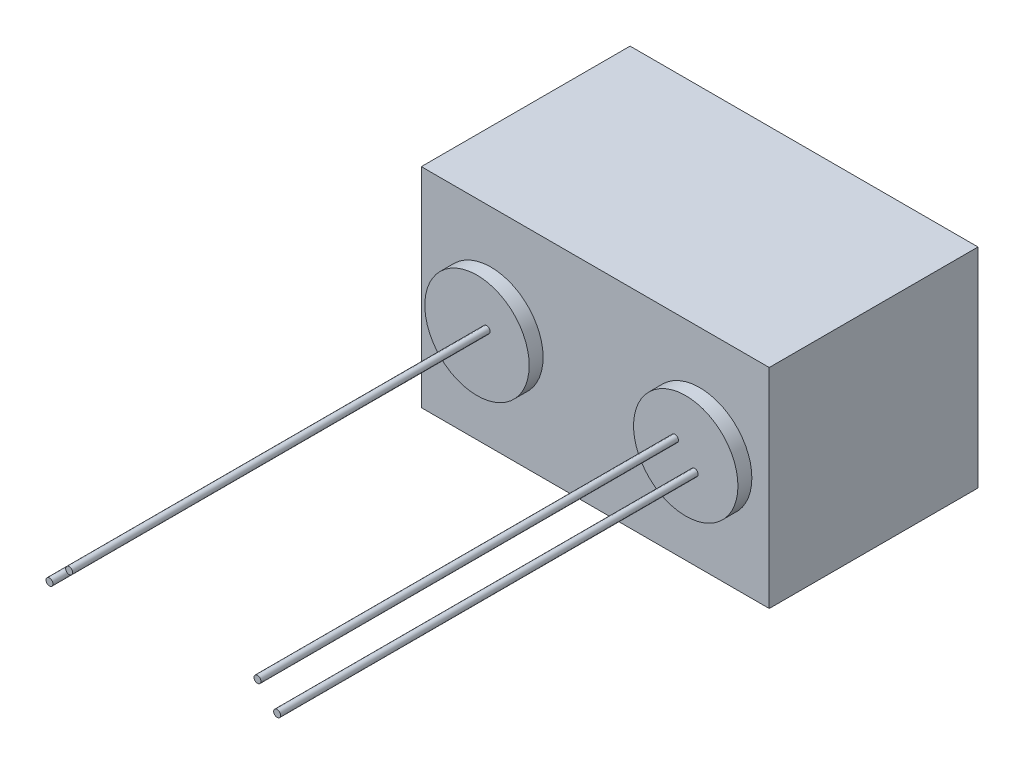
ISO-10303-21;
HEADER;
FILE_DESCRIPTION(('STEP AP214'),'2;1');
FILE_NAME('part.step','',(''),(''),'','','');
FILE_SCHEMA(('AUTOMOTIVE_DESIGN { 1 0 10303 214 1 1 1 1 }'));
ENDSEC;
DATA;
#1=APPLICATION_CONTEXT('core data for automotive mechanical design processes');
#2=APPLICATION_PROTOCOL_DEFINITION('international standard','automotive_design',2000,#1);
#3=PRODUCT_CONTEXT('',#1,'mechanical');
#4=PRODUCT('Part','Part','',(#3));
#5=PRODUCT_RELATED_PRODUCT_CATEGORY('part','',(#4));
#6=PRODUCT_DEFINITION_FORMATION('','',#4);
#7=PRODUCT_DEFINITION_CONTEXT('part definition',#1,'design');
#8=PRODUCT_DEFINITION('design','',#6,#7);
#9=PRODUCT_DEFINITION_SHAPE('','',#8);
#10=(LENGTH_UNIT() NAMED_UNIT(*) SI_UNIT(.MILLI.,.METRE.));
#11=(NAMED_UNIT(*) PLANE_ANGLE_UNIT() SI_UNIT($,.RADIAN.));
#12=(NAMED_UNIT(*) SI_UNIT($,.STERADIAN.) SOLID_ANGLE_UNIT());
#13=UNCERTAINTY_MEASURE_WITH_UNIT(LENGTH_MEASURE(1.E-05),#10,'distance_accuracy_value','');
#14=(GEOMETRIC_REPRESENTATION_CONTEXT(3) GLOBAL_UNCERTAINTY_ASSIGNED_CONTEXT((#13)) GLOBAL_UNIT_ASSIGNED_CONTEXT((#10,
#11,#12)) REPRESENTATION_CONTEXT('',''));
#15=CARTESIAN_POINT('',(0.,0.,0.));
#16=DIRECTION('',(0.,0.,1.));
#17=DIRECTION('',(1.,0.,0.));
#18=AXIS2_PLACEMENT_3D('',#15,#16,#17);
#19=CARTESIAN_POINT('',(-63.5,38.1,76.2));
#20=DIRECTION('',(1.,0.,0.));
#21=DIRECTION('',(0.,0.,-1.));
#22=AXIS2_PLACEMENT_3D('',#19,#20,#21);
#23=PLANE('',#22);
#24=DIRECTION('',(0.,-1.,0.));
#25=VECTOR('',#24,1.);
#26=CARTESIAN_POINT('',(-63.5,38.1,0.));
#27=LINE('',#26,#25);
#28=CARTESIAN_POINT('',(-63.5,38.1,0.));
#29=VERTEX_POINT('',#28);
#30=CARTESIAN_POINT('',(-63.5,-38.1,0.));
#31=VERTEX_POINT('',#30);
#32=EDGE_CURVE('E100',#29,#31,#27,.T.);
#33=ORIENTED_EDGE('',*,*,#32,.T.);
#34=DIRECTION('',(0.,0.,-1.));
#35=VECTOR('',#34,1.);
#36=CARTESIAN_POINT('',(-63.5,-38.1,76.2));
#37=LINE('',#36,#35);
#38=CARTESIAN_POINT('',(-63.5,-38.1,76.2));
#39=VERTEX_POINT('',#38);
#40=EDGE_CURVE('E11',#39,#31,#37,.T.);
#41=ORIENTED_EDGE('',*,*,#40,.F.);
#42=DIRECTION('',(0.,-1.,0.));
#43=VECTOR('',#42,1.);
#44=CARTESIAN_POINT('',(-63.5,38.1,76.2));
#45=LINE('',#44,#43);
#46=CARTESIAN_POINT('',(-63.5,38.1,76.2));
#47=VERTEX_POINT('',#46);
#48=EDGE_CURVE('E88',#47,#39,#45,.T.);
#49=ORIENTED_EDGE('',*,*,#48,.F.);
#50=DIRECTION('',(0.,0.,-1.));
#51=VECTOR('',#50,1.);
#52=CARTESIAN_POINT('',(-63.5,38.1,76.2));
#53=LINE('',#52,#51);
#54=EDGE_CURVE('E96',#47,#29,#53,.T.);
#55=ORIENTED_EDGE('',*,*,#54,.T.);
#56=EDGE_LOOP('',(#33,#41,#49,#55));
#57=FACE_BOUND('',#56,.T.);
#58=ADVANCED_FACE('F37',(#57),#23,.F.);
#59=CARTESIAN_POINT('',(-63.5,-38.1,76.2));
#60=DIRECTION('',(0.,1.,0.));
#61=DIRECTION('',(0.,0.,1.));
#62=AXIS2_PLACEMENT_3D('',#59,#60,#61);
#63=PLANE('',#62);
#64=DIRECTION('',(1.,0.,0.));
#65=VECTOR('',#64,1.);
#66=CARTESIAN_POINT('',(-63.5,-38.1,0.));
#67=LINE('',#66,#65);
#68=CARTESIAN_POINT('',(63.5,-38.1,0.));
#69=VERTEX_POINT('',#68);
#70=EDGE_CURVE('E92',#31,#69,#67,.T.);
#71=ORIENTED_EDGE('',*,*,#70,.T.);
#72=DIRECTION('',(0.,0.,-1.));
#73=VECTOR('',#72,1.);
#74=CARTESIAN_POINT('',(63.5,-38.1,76.2));
#75=LINE('',#74,#73);
#76=CARTESIAN_POINT('',(63.5,-38.1,76.2));
#77=VERTEX_POINT('',#76);
#78=EDGE_CURVE('E45',#77,#69,#75,.T.);
#79=ORIENTED_EDGE('',*,*,#78,.F.);
#80=DIRECTION('',(1.,0.,0.));
#81=VECTOR('',#80,1.);
#82=CARTESIAN_POINT('',(-63.5,-38.1,76.2));
#83=LINE('',#82,#81);
#84=EDGE_CURVE('E83',#39,#77,#83,.T.);
#85=ORIENTED_EDGE('',*,*,#84,.F.);
#86=ORIENTED_EDGE('',*,*,#40,.T.);
#87=EDGE_LOOP('',(#71,#79,#85,#86));
#88=FACE_BOUND('',#87,.T.);
#89=ADVANCED_FACE('F91',(#88),#63,.F.);
#90=CARTESIAN_POINT('',(63.5,38.1,76.2));
#91=DIRECTION('',(-1.,0.,0.));
#92=DIRECTION('',(0.,-1.,0.));
#93=AXIS2_PLACEMENT_3D('',#90,#91,#92);
#94=PLANE('',#93);
#95=DIRECTION('',(0.,1.,0.));
#96=VECTOR('',#95,1.);
#97=CARTESIAN_POINT('',(63.5,38.1,0.));
#98=LINE('',#97,#96);
#99=CARTESIAN_POINT('',(63.5,38.1,0.));
#100=VERTEX_POINT('',#99);
#101=EDGE_CURVE('E70',#69,#100,#98,.T.);
#102=ORIENTED_EDGE('',*,*,#101,.T.);
#103=DIRECTION('',(0.,0.,-1.));
#104=VECTOR('',#103,1.);
#105=CARTESIAN_POINT('',(63.5,38.1,76.2));
#106=LINE('',#105,#104);
#107=CARTESIAN_POINT('',(63.5,38.1,76.2));
#108=VERTEX_POINT('',#107);
#109=EDGE_CURVE('E93',#108,#100,#106,.T.);
#110=ORIENTED_EDGE('',*,*,#109,.F.);
#111=DIRECTION('',(0.,1.,0.));
#112=VECTOR('',#111,1.);
#113=CARTESIAN_POINT('',(63.5,38.1,76.2));
#114=LINE('',#113,#112);
#115=EDGE_CURVE('E86',#77,#108,#114,.T.);
#116=ORIENTED_EDGE('',*,*,#115,.F.);
#117=ORIENTED_EDGE('',*,*,#78,.T.);
#118=EDGE_LOOP('',(#102,#110,#116,#117));
#119=FACE_BOUND('',#118,.T.);
#120=ADVANCED_FACE('F94',(#119),#94,.F.);
#121=CARTESIAN_POINT('',(-63.5,38.1,76.2));
#122=DIRECTION('',(0.,-1.,0.));
#123=DIRECTION('',(0.,0.,-1.));
#124=AXIS2_PLACEMENT_3D('',#121,#122,#123);
#125=PLANE('',#124);
#126=DIRECTION('',(-1.,0.,0.));
#127=VECTOR('',#126,1.);
#128=CARTESIAN_POINT('',(-63.5,38.1,0.));
#129=LINE('',#128,#127);
#130=EDGE_CURVE('E76',#100,#29,#129,.T.);
#131=ORIENTED_EDGE('',*,*,#130,.T.);
#132=ORIENTED_EDGE('',*,*,#54,.F.);
#133=DIRECTION('',(-1.,0.,0.));
#134=VECTOR('',#133,1.);
#135=CARTESIAN_POINT('',(-63.5,38.1,76.2));
#136=LINE('',#135,#134);
#137=EDGE_CURVE('E53',#108,#47,#136,.T.);
#138=ORIENTED_EDGE('',*,*,#137,.F.);
#139=ORIENTED_EDGE('',*,*,#109,.T.);
#140=EDGE_LOOP('',(#131,#132,#138,#139));
#141=FACE_BOUND('',#140,.T.);
#142=ADVANCED_FACE('F108',(#141),#125,.F.);
#143=CARTESIAN_POINT('',(0.,0.,76.2));
#144=DIRECTION('',(0.,0.,1.));
#145=DIRECTION('',(1.,0.,0.));
#146=AXIS2_PLACEMENT_3D('',#143,#144,#145);
#147=PLANE('',#146);
#148=CARTESIAN_POINT('',(-38.1,0.,76.2));
#149=DIRECTION('',(0.,0.,1.));
#150=DIRECTION('',(1.,0.,0.));
#151=AXIS2_PLACEMENT_3D('',#148,#149,#150);
#152=CIRCLE('',#151,19.05);
#153=CARTESIAN_POINT('',(-19.05,0.,76.2));
#154=VERTEX_POINT('',#153);
#155=EDGE_CURVE('E120',#154,#154,#152,.T.);
#156=ORIENTED_EDGE('',*,*,#155,.F.);
#157=EDGE_LOOP('',(#156));
#158=FACE_BOUND('',#157,.T.);
#159=CARTESIAN_POINT('',(38.1,0.,76.2));
#160=DIRECTION('',(0.,0.,1.));
#161=DIRECTION('',(1.,0.,0.));
#162=AXIS2_PLACEMENT_3D('',#159,#160,#161);
#163=CIRCLE('',#162,19.05);
#164=CARTESIAN_POINT('',(57.15,0.,76.2));
#165=VERTEX_POINT('',#164);
#166=EDGE_CURVE('E114',#165,#165,#163,.T.);
#167=ORIENTED_EDGE('',*,*,#166,.F.);
#168=EDGE_LOOP('',(#167));
#169=FACE_BOUND('',#168,.T.);
#170=ORIENTED_EDGE('',*,*,#48,.T.);
#171=ORIENTED_EDGE('',*,*,#84,.T.);
#172=ORIENTED_EDGE('',*,*,#115,.T.);
#173=ORIENTED_EDGE('',*,*,#137,.T.);
#174=EDGE_LOOP('',(#170,#171,#172,#173));
#175=FACE_BOUND('',#174,.T.);
#176=ADVANCED_FACE('F84',(#158,#169,#175),#147,.T.);
#177=CARTESIAN_POINT('',(0.,0.,0.));
#178=DIRECTION('',(0.,0.,1.));
#179=DIRECTION('',(1.,0.,0.));
#180=AXIS2_PLACEMENT_3D('',#177,#178,#179);
#181=PLANE('',#180);
#182=ORIENTED_EDGE('',*,*,#32,.F.);
#183=ORIENTED_EDGE('',*,*,#130,.F.);
#184=ORIENTED_EDGE('',*,*,#101,.F.);
#185=ORIENTED_EDGE('',*,*,#70,.F.);
#186=EDGE_LOOP('',(#182,#183,#184,#185));
#187=FACE_BOUND('',#186,.T.);
#188=ADVANCED_FACE('F111',(#187),#181,.F.);
#189=CARTESIAN_POINT('',(38.1,0.,81.28));
#190=DIRECTION('',(0.,0.,-1.));
#191=DIRECTION('',(-1.,0.,0.));
#192=AXIS2_PLACEMENT_3D('',#189,#190,#191);
#193=CYLINDRICAL_SURFACE('',#192,19.05);
#194=CARTESIAN_POINT('',(38.1,0.,81.28));
#195=DIRECTION('',(0.,0.,1.));
#196=DIRECTION('',(1.,0.,0.));
#197=AXIS2_PLACEMENT_3D('',#194,#195,#196);
#198=CIRCLE('',#197,19.05);
#199=CARTESIAN_POINT('',(57.15,0.,81.28));
#200=VERTEX_POINT('',#199);
#201=EDGE_CURVE('E103',#200,#200,#198,.T.);
#202=ORIENTED_EDGE('',*,*,#201,.F.);
#203=EDGE_LOOP('',(#202));
#204=FACE_BOUND('',#203,.T.);
#205=ORIENTED_EDGE('',*,*,#166,.T.);
#206=EDGE_LOOP('',(#205));
#207=FACE_BOUND('',#206,.T.);
#208=ADVANCED_FACE('F180',(#204,#207),#193,.T.);
#209=CARTESIAN_POINT('',(38.1,0.,81.28));
#210=DIRECTION('',(0.,0.,1.));
#211=DIRECTION('',(1.,0.,0.));
#212=AXIS2_PLACEMENT_3D('',#209,#210,#211);
#213=PLANE('',#212);
#214=CARTESIAN_POINT('',(34.166429733293,3.59210244842766,81.28));
#215=DIRECTION('',(0.,0.,1.));
#216=DIRECTION('',(1.,0.,0.));
#217=AXIS2_PLACEMENT_3D('',#214,#215,#216);
#218=CIRCLE('',#217,1.27);
#219=CARTESIAN_POINT('',(32.896429733293,3.59210244842766,81.28));
#220=VERTEX_POINT('',#219);
#221=EDGE_CURVE('E132',#220,#220,#218,.T.);
#222=ORIENTED_EDGE('',*,*,#221,.F.);
#223=EDGE_LOOP('',(#222));
#224=FACE_BOUND('',#223,.T.);
#225=CARTESIAN_POINT('',(41.3506346301483,-3.59210244842766,81.28));
#226=DIRECTION('',(0.,0.,1.));
#227=DIRECTION('',(1.,0.,0.));
#228=AXIS2_PLACEMENT_3D('',#225,#226,#227);
#229=CIRCLE('',#228,1.27);
#230=CARTESIAN_POINT('',(40.0806346301483,-3.59210244842766,81.28));
#231=VERTEX_POINT('',#230);
#232=EDGE_CURVE('E126',#231,#231,#229,.T.);
#233=ORIENTED_EDGE('',*,*,#232,.F.);
#234=EDGE_LOOP('',(#233));
#235=FACE_BOUND('',#234,.T.);
#236=ORIENTED_EDGE('',*,*,#201,.T.);
#237=EDGE_LOOP('',(#236));
#238=FACE_BOUND('',#237,.T.);
#239=ADVANCED_FACE('F171',(#224,#235,#238),#213,.T.);
#240=CARTESIAN_POINT('',(-38.1,0.,81.28));
#241=DIRECTION('',(0.,0.,-1.));
#242=DIRECTION('',(-1.,0.,0.));
#243=AXIS2_PLACEMENT_3D('',#240,#241,#242);
#244=CYLINDRICAL_SURFACE('',#243,19.05);
#245=CARTESIAN_POINT('',(-38.1,0.,81.28));
#246=DIRECTION('',(0.,0.,1.));
#247=DIRECTION('',(1.,0.,0.));
#248=AXIS2_PLACEMENT_3D('',#245,#246,#247);
#249=CIRCLE('',#248,19.05);
#250=CARTESIAN_POINT('',(-19.05,0.,81.28));
#251=VERTEX_POINT('',#250);
#252=EDGE_CURVE('E117',#251,#251,#249,.T.);
#253=ORIENTED_EDGE('',*,*,#252,.F.);
#254=EDGE_LOOP('',(#253));
#255=FACE_BOUND('',#254,.T.);
#256=ORIENTED_EDGE('',*,*,#155,.T.);
#257=EDGE_LOOP('',(#256));
#258=FACE_BOUND('',#257,.T.);
#259=ADVANCED_FACE('F163',(#255,#258),#244,.T.);
#260=CARTESIAN_POINT('',(-38.1,0.,81.28));
#261=DIRECTION('',(0.,0.,1.));
#262=DIRECTION('',(1.,0.,0.));
#263=AXIS2_PLACEMENT_3D('',#260,#261,#262);
#264=PLANE('',#263);
#265=CARTESIAN_POINT('',(-34.57098543524,3.59210244842768,81.28));
#266=DIRECTION('',(0.,0.,1.));
#267=DIRECTION('',(1.,0.,0.));
#268=AXIS2_PLACEMENT_3D('',#265,#266,#267);
#269=CIRCLE('',#268,1.27);
#270=CARTESIAN_POINT('',(-35.84098543524,3.59210244842768,81.28));
#271=VERTEX_POINT('',#270);
#272=EDGE_CURVE('E144',#271,#271,#269,.T.);
#273=ORIENTED_EDGE('',*,*,#272,.F.);
#274=EDGE_LOOP('',(#273));
#275=FACE_BOUND('',#274,.T.);
#276=CARTESIAN_POINT('',(-41.7551903320952,-3.59210244842768,81.28));
#277=DIRECTION('',(0.,0.,1.));
#278=DIRECTION('',(1.,0.,0.));
#279=AXIS2_PLACEMENT_3D('',#276,#277,#278);
#280=CIRCLE('',#279,1.26999999999994);
#281=CARTESIAN_POINT('',(-43.0251903320952,-3.59210244842768,81.28));
#282=VERTEX_POINT('',#281);
#283=EDGE_CURVE('E138',#282,#282,#280,.T.);
#284=ORIENTED_EDGE('',*,*,#283,.F.);
#285=EDGE_LOOP('',(#284));
#286=FACE_BOUND('',#285,.T.);
#287=ORIENTED_EDGE('',*,*,#252,.T.);
#288=EDGE_LOOP('',(#287));
#289=FACE_BOUND('',#288,.T.);
#290=ADVANCED_FACE('F159',(#275,#286,#289),#264,.T.);
#291=CARTESIAN_POINT('',(41.3506346301483,-3.59210244842766,233.68));
#292=DIRECTION('',(0.,0.,-1.));
#293=DIRECTION('',(-1.,0.,0.));
#294=AXIS2_PLACEMENT_3D('',#291,#292,#293);
#295=CYLINDRICAL_SURFACE('',#294,1.27);
#296=CARTESIAN_POINT('',(41.3506346301483,-3.59210244842766,233.68));
#297=DIRECTION('',(0.,0.,1.));
#298=DIRECTION('',(1.,0.,0.));
#299=AXIS2_PLACEMENT_3D('',#296,#297,#298);
#300=CIRCLE('',#299,1.27);
#301=CARTESIAN_POINT('',(40.0806346301483,-3.59210244842766,233.68));
#302=VERTEX_POINT('',#301);
#303=EDGE_CURVE('E123',#302,#302,#300,.T.);
#304=CARTESIAN_POINT('',(40.0806346301483,-3.59210244842766,233.68));
#305=CARTESIAN_POINT('',(40.0806346301483,-3.59210244842766,232.0925));
#306=CARTESIAN_POINT('',(40.0806346301483,-3.59210244842766,230.505));
#307=CARTESIAN_POINT('',(40.0806346301483,-3.59210244842766,227.33));
#308=CARTESIAN_POINT('',(40.0806346301483,-3.59210244842766,225.7425));
#309=CARTESIAN_POINT('',(40.0806346301483,-3.59210244842766,222.5675));
#310=CARTESIAN_POINT('',(40.0806346301483,-3.59210244842766,220.98));
#311=CARTESIAN_POINT('',(40.0806346301483,-3.59210244842766,217.805));
#312=CARTESIAN_POINT('',(40.0806346301483,-3.59210244842766,216.2175));
#313=CARTESIAN_POINT('',(40.0806346301483,-3.59210244842766,213.0425));
#314=CARTESIAN_POINT('',(40.0806346301483,-3.59210244842766,211.455));
#315=CARTESIAN_POINT('',(40.0806346301483,-3.59210244842766,208.28));
#316=CARTESIAN_POINT('',(40.0806346301483,-3.59210244842766,206.6925));
#317=CARTESIAN_POINT('',(40.0806346301483,-3.59210244842766,203.5175));
#318=CARTESIAN_POINT('',(40.0806346301483,-3.59210244842766,201.93));
#319=CARTESIAN_POINT('',(40.0806346301483,-3.59210244842766,198.755));
#320=CARTESIAN_POINT('',(40.0806346301483,-3.59210244842766,197.1675));
#321=CARTESIAN_POINT('',(40.0806346301483,-3.59210244842766,193.9925));
#322=CARTESIAN_POINT('',(40.0806346301483,-3.59210244842766,192.405));
#323=CARTESIAN_POINT('',(40.0806346301483,-3.59210244842766,189.23));
#324=CARTESIAN_POINT('',(40.0806346301483,-3.59210244842766,187.6425));
#325=CARTESIAN_POINT('',(40.0806346301483,-3.59210244842766,184.4675));
#326=CARTESIAN_POINT('',(40.0806346301483,-3.59210244842766,182.88));
#327=CARTESIAN_POINT('',(40.0806346301483,-3.59210244842766,179.705));
#328=CARTESIAN_POINT('',(40.0806346301483,-3.59210244842766,178.1175));
#329=CARTESIAN_POINT('',(40.0806346301483,-3.59210244842766,174.9425));
#330=CARTESIAN_POINT('',(40.0806346301483,-3.59210244842766,173.355));
#331=CARTESIAN_POINT('',(40.0806346301483,-3.59210244842766,170.18));
#332=CARTESIAN_POINT('',(40.0806346301483,-3.59210244842766,168.5925));
#333=CARTESIAN_POINT('',(40.0806346301483,-3.59210244842766,165.4175));
#334=CARTESIAN_POINT('',(40.0806346301483,-3.59210244842766,163.83));
#335=CARTESIAN_POINT('',(40.0806346301483,-3.59210244842766,160.655));
#336=CARTESIAN_POINT('',(40.0806346301483,-3.59210244842766,159.0675));
#337=CARTESIAN_POINT('',(40.0806346301483,-3.59210244842766,155.8925));
#338=CARTESIAN_POINT('',(40.0806346301483,-3.59210244842766,154.305));
#339=CARTESIAN_POINT('',(40.0806346301483,-3.59210244842766,151.13));
#340=CARTESIAN_POINT('',(40.0806346301483,-3.59210244842766,149.5425));
#341=CARTESIAN_POINT('',(40.0806346301483,-3.59210244842766,146.3675));
#342=CARTESIAN_POINT('',(40.0806346301483,-3.59210244842766,144.78));
#343=CARTESIAN_POINT('',(40.0806346301483,-3.59210244842766,141.605));
#344=CARTESIAN_POINT('',(40.0806346301483,-3.59210244842766,140.0175));
#345=CARTESIAN_POINT('',(40.0806346301483,-3.59210244842766,136.8425));
#346=CARTESIAN_POINT('',(40.0806346301483,-3.59210244842766,135.255));
#347=CARTESIAN_POINT('',(40.0806346301483,-3.59210244842766,132.08));
#348=CARTESIAN_POINT('',(40.0806346301483,-3.59210244842766,130.4925));
#349=CARTESIAN_POINT('',(40.0806346301483,-3.59210244842766,127.3175));
#350=CARTESIAN_POINT('',(40.0806346301483,-3.59210244842766,125.73));
#351=CARTESIAN_POINT('',(40.0806346301483,-3.59210244842766,122.555));
#352=CARTESIAN_POINT('',(40.0806346301483,-3.59210244842766,120.9675));
#353=CARTESIAN_POINT('',(40.0806346301483,-3.59210244842766,117.7925));
#354=CARTESIAN_POINT('',(40.0806346301483,-3.59210244842766,116.205));
#355=CARTESIAN_POINT('',(40.0806346301483,-3.59210244842766,113.03));
#356=CARTESIAN_POINT('',(40.0806346301483,-3.59210244842766,111.4425));
#357=CARTESIAN_POINT('',(40.0806346301483,-3.59210244842766,108.2675));
#358=CARTESIAN_POINT('',(40.0806346301483,-3.59210244842766,106.68));
#359=CARTESIAN_POINT('',(40.0806346301483,-3.59210244842766,103.505));
#360=CARTESIAN_POINT('',(40.0806346301483,-3.59210244842766,101.9175));
#361=CARTESIAN_POINT('',(40.0806346301483,-3.59210244842766,98.7425));
#362=CARTESIAN_POINT('',(40.0806346301483,-3.59210244842766,97.155));
#363=CARTESIAN_POINT('',(40.0806346301483,-3.59210244842766,93.98));
#364=CARTESIAN_POINT('',(40.0806346301483,-3.59210244842766,92.3925));
#365=CARTESIAN_POINT('',(40.0806346301483,-3.59210244842766,89.2175));
#366=CARTESIAN_POINT('',(40.0806346301483,-3.59210244842766,87.63));
#367=CARTESIAN_POINT('',(40.0806346301483,-3.59210244842766,84.455));
#368=CARTESIAN_POINT('',(40.0806346301483,-3.59210244842766,82.8675));
#369=CARTESIAN_POINT('',(40.0806346301483,-3.59210244842766,81.28));
#370=B_SPLINE_CURVE_WITH_KNOTS('',3,(#304,#305,#306,#307,#308,#309,#310,#311,#312,#313,#314,
#315,#316,#317,#318,#319,#320,#321,#322,#323,#324,#325,#326,#327,#328,#329,#330,#331,#332,#333,
#334,#335,#336,#337,#338,#339,#340,#341,#342,#343,#344,#345,#346,#347,#348,#349,#350,#351,#352,
#353,#354,#355,#356,#357,#358,#359,#360,#361,#362,#363,#364,#365,#366,#367,#368,#369),
.UNSPECIFIED.,.F.,.F.,(4,2,2,2,2,2,2,2,2,2,2,2,2,2,2,2,2,2,2,2,2,2,2,2,2,2,2,2,2,2,2,2,4),(0.,
4.7625,9.52500000000001,14.2875,19.05,23.8125,28.575,33.3375,38.1,42.8625,47.625,52.3875,57.15,
61.9125,66.675,71.4375,76.2,80.9625,85.725,90.4875,95.25,100.0125,104.775,109.5375,114.3,
119.0625,123.825,128.5875,133.35,138.1125,142.875,147.6375,152.4),.UNSPECIFIED.);
#371=EDGE_CURVE('BSEAM162',#302,#231,#370,.T.);
#372=ORIENTED_EDGE('',*,*,#303,.F.);
#373=ORIENTED_EDGE('',*,*,#232,.T.);
#374=ORIENTED_EDGE('',*,*,#371,.T.);
#375=ORIENTED_EDGE('',*,*,#371,.F.);
#376=EDGE_LOOP('',(#372,#374,#373,#375));
#377=FACE_BOUND('',#376,.T.);
#378=ADVANCED_FACE('F162',(#377),#295,.T.);
#379=CARTESIAN_POINT('',(41.3506346301483,-3.59210244842766,233.68));
#380=DIRECTION('',(0.,0.,1.));
#381=DIRECTION('',(1.,0.,0.));
#382=AXIS2_PLACEMENT_3D('',#379,#380,#381);
#383=PLANE('',#382);
#384=ORIENTED_EDGE('',*,*,#303,.T.);
#385=EDGE_LOOP('',(#384));
#386=FACE_BOUND('',#385,.T.);
#387=ADVANCED_FACE('F245',(#386),#383,.T.);
#388=CARTESIAN_POINT('',(34.166429733293,3.59210244842766,233.68));
#389=DIRECTION('',(0.,0.,-1.));
#390=DIRECTION('',(-1.,0.,0.));
#391=AXIS2_PLACEMENT_3D('',#388,#389,#390);
#392=CYLINDRICAL_SURFACE('',#391,1.27);
#393=CARTESIAN_POINT('',(34.166429733293,3.59210244842766,233.68));
#394=DIRECTION('',(0.,0.,1.));
#395=DIRECTION('',(1.,0.,0.));
#396=AXIS2_PLACEMENT_3D('',#393,#394,#395);
#397=CIRCLE('',#396,1.27);
#398=CARTESIAN_POINT('',(32.896429733293,3.59210244842766,233.68));
#399=VERTEX_POINT('',#398);
#400=EDGE_CURVE('E129',#399,#399,#397,.T.);
#401=CARTESIAN_POINT('',(32.896429733293,3.59210244842766,233.68));
#402=CARTESIAN_POINT('',(32.896429733293,3.59210244842766,232.0925));
#403=CARTESIAN_POINT('',(32.896429733293,3.59210244842766,230.505));
#404=CARTESIAN_POINT('',(32.896429733293,3.59210244842766,227.33));
#405=CARTESIAN_POINT('',(32.896429733293,3.59210244842766,225.7425));
#406=CARTESIAN_POINT('',(32.896429733293,3.59210244842766,222.5675));
#407=CARTESIAN_POINT('',(32.896429733293,3.59210244842766,220.98));
#408=CARTESIAN_POINT('',(32.896429733293,3.59210244842766,217.805));
#409=CARTESIAN_POINT('',(32.896429733293,3.59210244842766,216.2175));
#410=CARTESIAN_POINT('',(32.896429733293,3.59210244842766,213.0425));
#411=CARTESIAN_POINT('',(32.896429733293,3.59210244842766,211.455));
#412=CARTESIAN_POINT('',(32.896429733293,3.59210244842766,208.28));
#413=CARTESIAN_POINT('',(32.896429733293,3.59210244842766,206.6925));
#414=CARTESIAN_POINT('',(32.896429733293,3.59210244842766,203.5175));
#415=CARTESIAN_POINT('',(32.896429733293,3.59210244842766,201.93));
#416=CARTESIAN_POINT('',(32.896429733293,3.59210244842766,198.755));
#417=CARTESIAN_POINT('',(32.896429733293,3.59210244842766,197.1675));
#418=CARTESIAN_POINT('',(32.896429733293,3.59210244842766,193.9925));
#419=CARTESIAN_POINT('',(32.896429733293,3.59210244842766,192.405));
#420=CARTESIAN_POINT('',(32.896429733293,3.59210244842766,189.23));
#421=CARTESIAN_POINT('',(32.896429733293,3.59210244842766,187.6425));
#422=CARTESIAN_POINT('',(32.896429733293,3.59210244842766,184.4675));
#423=CARTESIAN_POINT('',(32.896429733293,3.59210244842766,182.88));
#424=CARTESIAN_POINT('',(32.896429733293,3.59210244842766,179.705));
#425=CARTESIAN_POINT('',(32.896429733293,3.59210244842766,178.1175));
#426=CARTESIAN_POINT('',(32.896429733293,3.59210244842766,174.9425));
#427=CARTESIAN_POINT('',(32.896429733293,3.59210244842766,173.355));
#428=CARTESIAN_POINT('',(32.896429733293,3.59210244842766,170.18));
#429=CARTESIAN_POINT('',(32.896429733293,3.59210244842766,168.5925));
#430=CARTESIAN_POINT('',(32.896429733293,3.59210244842766,165.4175));
#431=CARTESIAN_POINT('',(32.896429733293,3.59210244842766,163.83));
#432=CARTESIAN_POINT('',(32.896429733293,3.59210244842766,160.655));
#433=CARTESIAN_POINT('',(32.896429733293,3.59210244842766,159.0675));
#434=CARTESIAN_POINT('',(32.896429733293,3.59210244842766,155.8925));
#435=CARTESIAN_POINT('',(32.896429733293,3.59210244842766,154.305));
#436=CARTESIAN_POINT('',(32.896429733293,3.59210244842766,151.13));
#437=CARTESIAN_POINT('',(32.896429733293,3.59210244842766,149.5425));
#438=CARTESIAN_POINT('',(32.896429733293,3.59210244842766,146.3675));
#439=CARTESIAN_POINT('',(32.896429733293,3.59210244842766,144.78));
#440=CARTESIAN_POINT('',(32.896429733293,3.59210244842766,141.605));
#441=CARTESIAN_POINT('',(32.896429733293,3.59210244842766,140.0175));
#442=CARTESIAN_POINT('',(32.896429733293,3.59210244842766,136.8425));
#443=CARTESIAN_POINT('',(32.896429733293,3.59210244842766,135.255));
#444=CARTESIAN_POINT('',(32.896429733293,3.59210244842766,132.08));
#445=CARTESIAN_POINT('',(32.896429733293,3.59210244842766,130.4925));
#446=CARTESIAN_POINT('',(32.896429733293,3.59210244842766,127.3175));
#447=CARTESIAN_POINT('',(32.896429733293,3.59210244842766,125.73));
#448=CARTESIAN_POINT('',(32.896429733293,3.59210244842766,122.555));
#449=CARTESIAN_POINT('',(32.896429733293,3.59210244842766,120.9675));
#450=CARTESIAN_POINT('',(32.896429733293,3.59210244842766,117.7925));
#451=CARTESIAN_POINT('',(32.896429733293,3.59210244842766,116.205));
#452=CARTESIAN_POINT('',(32.896429733293,3.59210244842766,113.03));
#453=CARTESIAN_POINT('',(32.896429733293,3.59210244842766,111.4425));
#454=CARTESIAN_POINT('',(32.896429733293,3.59210244842766,108.2675));
#455=CARTESIAN_POINT('',(32.896429733293,3.59210244842766,106.68));
#456=CARTESIAN_POINT('',(32.896429733293,3.59210244842766,103.505));
#457=CARTESIAN_POINT('',(32.896429733293,3.59210244842766,101.9175));
#458=CARTESIAN_POINT('',(32.896429733293,3.59210244842766,98.7425));
#459=CARTESIAN_POINT('',(32.896429733293,3.59210244842766,97.155));
#460=CARTESIAN_POINT('',(32.896429733293,3.59210244842766,93.98));
#461=CARTESIAN_POINT('',(32.896429733293,3.59210244842766,92.3925));
#462=CARTESIAN_POINT('',(32.896429733293,3.59210244842766,89.2175));
#463=CARTESIAN_POINT('',(32.896429733293,3.59210244842766,87.63));
#464=CARTESIAN_POINT('',(32.896429733293,3.59210244842766,84.455));
#465=CARTESIAN_POINT('',(32.896429733293,3.59210244842766,82.8675));
#466=CARTESIAN_POINT('',(32.896429733293,3.59210244842766,81.28));
#467=B_SPLINE_CURVE_WITH_KNOTS('',3,(#401,#402,#403,#404,#405,#406,#407,#408,#409,#410,#411,
#412,#413,#414,#415,#416,#417,#418,#419,#420,#421,#422,#423,#424,#425,#426,#427,#428,#429,#430,
#431,#432,#433,#434,#435,#436,#437,#438,#439,#440,#441,#442,#443,#444,#445,#446,#447,#448,#449,
#450,#451,#452,#453,#454,#455,#456,#457,#458,#459,#460,#461,#462,#463,#464,#465,#466),
.UNSPECIFIED.,.F.,.F.,(4,2,2,2,2,2,2,2,2,2,2,2,2,2,2,2,2,2,2,2,2,2,2,2,2,2,2,2,2,2,2,2,4),(0.,
4.7625,9.52500000000001,14.2875,19.05,23.8125,28.575,33.3375,38.1,42.8625,47.625,52.3875,57.15,
61.9125,66.675,71.4375,76.2,80.9625,85.725,90.4875,95.25,100.0125,104.775,109.5375,114.3,
119.0625,123.825,128.5875,133.35,138.1125,142.875,147.6375,152.4),.UNSPECIFIED.);
#468=EDGE_CURVE('BSEAM254',#399,#220,#467,.T.);
#469=ORIENTED_EDGE('',*,*,#400,.F.);
#470=ORIENTED_EDGE('',*,*,#221,.T.);
#471=ORIENTED_EDGE('',*,*,#468,.T.);
#472=ORIENTED_EDGE('',*,*,#468,.F.);
#473=EDGE_LOOP('',(#469,#471,#470,#472));
#474=FACE_BOUND('',#473,.T.);
#475=ADVANCED_FACE('F254',(#474),#392,.T.);
#476=CARTESIAN_POINT('',(34.166429733293,3.59210244842766,233.68));
#477=DIRECTION('',(0.,0.,1.));
#478=DIRECTION('',(1.,0.,0.));
#479=AXIS2_PLACEMENT_3D('',#476,#477,#478);
#480=PLANE('',#479);
#481=ORIENTED_EDGE('',*,*,#400,.T.);
#482=EDGE_LOOP('',(#481));
#483=FACE_BOUND('',#482,.T.);
#484=ADVANCED_FACE('F263',(#483),#480,.T.);
#485=CARTESIAN_POINT('',(-41.7551903320952,-3.59210244842768,233.68));
#486=DIRECTION('',(0.,0.,-1.));
#487=DIRECTION('',(-1.,0.,0.));
#488=AXIS2_PLACEMENT_3D('',#485,#486,#487);
#489=CYLINDRICAL_SURFACE('',#488,1.26999999999994);
#490=CARTESIAN_POINT('',(-41.7551903320952,-3.59210244842768,233.68));
#491=DIRECTION('',(0.,0.,1.));
#492=DIRECTION('',(1.,0.,0.));
#493=AXIS2_PLACEMENT_3D('',#490,#491,#492);
#494=CIRCLE('',#493,1.26999999999994);
#495=CARTESIAN_POINT('',(-43.0251903320952,-3.59210244842768,233.68));
#496=VERTEX_POINT('',#495);
#497=EDGE_CURVE('E135',#496,#496,#494,.T.);
#498=CARTESIAN_POINT('',(-43.0251903320952,-3.59210244842768,233.68));
#499=CARTESIAN_POINT('',(-43.0251903320952,-3.59210244842768,232.0925));
#500=CARTESIAN_POINT('',(-43.0251903320952,-3.59210244842768,230.505));
#501=CARTESIAN_POINT('',(-43.0251903320952,-3.59210244842768,227.33));
#502=CARTESIAN_POINT('',(-43.0251903320952,-3.59210244842768,225.7425));
#503=CARTESIAN_POINT('',(-43.0251903320952,-3.59210244842768,222.5675));
#504=CARTESIAN_POINT('',(-43.0251903320952,-3.59210244842768,220.98));
#505=CARTESIAN_POINT('',(-43.0251903320952,-3.59210244842768,217.805));
#506=CARTESIAN_POINT('',(-43.0251903320952,-3.59210244842768,216.2175));
#507=CARTESIAN_POINT('',(-43.0251903320952,-3.59210244842768,213.0425));
#508=CARTESIAN_POINT('',(-43.0251903320952,-3.59210244842768,211.455));
#509=CARTESIAN_POINT('',(-43.0251903320952,-3.59210244842768,208.28));
#510=CARTESIAN_POINT('',(-43.0251903320952,-3.59210244842768,206.6925));
#511=CARTESIAN_POINT('',(-43.0251903320952,-3.59210244842768,203.5175));
#512=CARTESIAN_POINT('',(-43.0251903320952,-3.59210244842768,201.93));
#513=CARTESIAN_POINT('',(-43.0251903320952,-3.59210244842768,198.755));
#514=CARTESIAN_POINT('',(-43.0251903320952,-3.59210244842768,197.1675));
#515=CARTESIAN_POINT('',(-43.0251903320952,-3.59210244842768,193.9925));
#516=CARTESIAN_POINT('',(-43.0251903320952,-3.59210244842768,192.405));
#517=CARTESIAN_POINT('',(-43.0251903320952,-3.59210244842768,189.23));
#518=CARTESIAN_POINT('',(-43.0251903320952,-3.59210244842768,187.6425));
#519=CARTESIAN_POINT('',(-43.0251903320952,-3.59210244842768,184.4675));
#520=CARTESIAN_POINT('',(-43.0251903320952,-3.59210244842768,182.88));
#521=CARTESIAN_POINT('',(-43.0251903320952,-3.59210244842768,179.705));
#522=CARTESIAN_POINT('',(-43.0251903320952,-3.59210244842768,178.1175));
#523=CARTESIAN_POINT('',(-43.0251903320952,-3.59210244842768,174.9425));
#524=CARTESIAN_POINT('',(-43.0251903320952,-3.59210244842768,173.355));
#525=CARTESIAN_POINT('',(-43.0251903320952,-3.59210244842768,170.18));
#526=CARTESIAN_POINT('',(-43.0251903320952,-3.59210244842768,168.5925));
#527=CARTESIAN_POINT('',(-43.0251903320952,-3.59210244842768,165.4175));
#528=CARTESIAN_POINT('',(-43.0251903320952,-3.59210244842768,163.83));
#529=CARTESIAN_POINT('',(-43.0251903320952,-3.59210244842768,160.655));
#530=CARTESIAN_POINT('',(-43.0251903320952,-3.59210244842768,159.0675));
#531=CARTESIAN_POINT('',(-43.0251903320952,-3.59210244842768,155.8925));
#532=CARTESIAN_POINT('',(-43.0251903320952,-3.59210244842768,154.305));
#533=CARTESIAN_POINT('',(-43.0251903320952,-3.59210244842768,151.13));
#534=CARTESIAN_POINT('',(-43.0251903320952,-3.59210244842768,149.5425));
#535=CARTESIAN_POINT('',(-43.0251903320952,-3.59210244842768,146.3675));
#536=CARTESIAN_POINT('',(-43.0251903320952,-3.59210244842768,144.78));
#537=CARTESIAN_POINT('',(-43.0251903320952,-3.59210244842768,141.605));
#538=CARTESIAN_POINT('',(-43.0251903320952,-3.59210244842768,140.0175));
#539=CARTESIAN_POINT('',(-43.0251903320952,-3.59210244842768,136.8425));
#540=CARTESIAN_POINT('',(-43.0251903320952,-3.59210244842768,135.255));
#541=CARTESIAN_POINT('',(-43.0251903320952,-3.59210244842768,132.08));
#542=CARTESIAN_POINT('',(-43.0251903320952,-3.59210244842768,130.4925));
#543=CARTESIAN_POINT('',(-43.0251903320952,-3.59210244842768,127.3175));
#544=CARTESIAN_POINT('',(-43.0251903320952,-3.59210244842768,125.73));
#545=CARTESIAN_POINT('',(-43.0251903320952,-3.59210244842768,122.555));
#546=CARTESIAN_POINT('',(-43.0251903320952,-3.59210244842768,120.9675));
#547=CARTESIAN_POINT('',(-43.0251903320952,-3.59210244842768,117.7925));
#548=CARTESIAN_POINT('',(-43.0251903320952,-3.59210244842768,116.205));
#549=CARTESIAN_POINT('',(-43.0251903320952,-3.59210244842768,113.03));
#550=CARTESIAN_POINT('',(-43.0251903320952,-3.59210244842768,111.4425));
#551=CARTESIAN_POINT('',(-43.0251903320952,-3.59210244842768,108.2675));
#552=CARTESIAN_POINT('',(-43.0251903320952,-3.59210244842768,106.68));
#553=CARTESIAN_POINT('',(-43.0251903320952,-3.59210244842768,103.505));
#554=CARTESIAN_POINT('',(-43.0251903320952,-3.59210244842768,101.9175));
#555=CARTESIAN_POINT('',(-43.0251903320952,-3.59210244842768,98.7425));
#556=CARTESIAN_POINT('',(-43.0251903320952,-3.59210244842768,97.155));
#557=CARTESIAN_POINT('',(-43.0251903320952,-3.59210244842768,93.98));
#558=CARTESIAN_POINT('',(-43.0251903320952,-3.59210244842768,92.3925));
#559=CARTESIAN_POINT('',(-43.0251903320952,-3.59210244842768,89.2175));
#560=CARTESIAN_POINT('',(-43.0251903320952,-3.59210244842768,87.63));
#561=CARTESIAN_POINT('',(-43.0251903320952,-3.59210244842768,84.455));
#562=CARTESIAN_POINT('',(-43.0251903320952,-3.59210244842768,82.8675));
#563=CARTESIAN_POINT('',(-43.0251903320952,-3.59210244842768,81.28));
#564=B_SPLINE_CURVE_WITH_KNOTS('',3,(#498,#499,#500,#501,#502,#503,#504,#505,#506,#507,#508,
#509,#510,#511,#512,#513,#514,#515,#516,#517,#518,#519,#520,#521,#522,#523,#524,#525,#526,#527,
#528,#529,#530,#531,#532,#533,#534,#535,#536,#537,#538,#539,#540,#541,#542,#543,#544,#545,#546,
#547,#548,#549,#550,#551,#552,#553,#554,#555,#556,#557,#558,#559,#560,#561,#562,#563),
.UNSPECIFIED.,.F.,.F.,(4,2,2,2,2,2,2,2,2,2,2,2,2,2,2,2,2,2,2,2,2,2,2,2,2,2,2,2,2,2,2,2,4),(0.,
4.7625,9.52500000000001,14.2875,19.05,23.8125,28.575,33.3375,38.1,42.8625,47.625,52.3875,57.15,
61.9125,66.675,71.4375,76.2,80.9625,85.725,90.4875,95.25,100.0125,104.775,109.5375,114.3,
119.0625,123.825,128.5875,133.35,138.1125,142.875,147.6375,152.4),.UNSPECIFIED.);
#565=EDGE_CURVE('BSEAM272',#496,#282,#564,.T.);
#566=ORIENTED_EDGE('',*,*,#497,.F.);
#567=ORIENTED_EDGE('',*,*,#283,.T.);
#568=ORIENTED_EDGE('',*,*,#565,.T.);
#569=ORIENTED_EDGE('',*,*,#565,.F.);
#570=EDGE_LOOP('',(#566,#568,#567,#569));
#571=FACE_BOUND('',#570,.T.);
#572=ADVANCED_FACE('F272',(#571),#489,.T.);
#573=CARTESIAN_POINT('',(-41.7551903320952,-3.59210244842768,233.68));
#574=DIRECTION('',(0.,0.,1.));
#575=DIRECTION('',(1.,0.,0.));
#576=AXIS2_PLACEMENT_3D('',#573,#574,#575);
#577=PLANE('',#576);
#578=ORIENTED_EDGE('',*,*,#497,.T.);
#579=EDGE_LOOP('',(#578));
#580=FACE_BOUND('',#579,.T.);
#581=ADVANCED_FACE('F155',(#580),#577,.T.);
#582=CARTESIAN_POINT('',(-34.57098543524,3.59210244842768,233.68));
#583=DIRECTION('',(0.,0.,-1.));
#584=DIRECTION('',(-1.,0.,0.));
#585=AXIS2_PLACEMENT_3D('',#582,#583,#584);
#586=CYLINDRICAL_SURFACE('',#585,1.27);
#587=CARTESIAN_POINT('',(-34.57098543524,3.59210244842768,233.68));
#588=DIRECTION('',(0.,0.,1.));
#589=DIRECTION('',(1.,0.,0.));
#590=AXIS2_PLACEMENT_3D('',#587,#588,#589);
#591=CIRCLE('',#590,1.27);
#592=CARTESIAN_POINT('',(-35.84098543524,3.59210244842768,233.68));
#593=VERTEX_POINT('',#592);
#594=EDGE_CURVE('E141',#593,#593,#591,.T.);
#595=CARTESIAN_POINT('',(-35.84098543524,3.59210244842768,233.68));
#596=CARTESIAN_POINT('',(-35.84098543524,3.59210244842768,232.0925));
#597=CARTESIAN_POINT('',(-35.84098543524,3.59210244842768,230.505));
#598=CARTESIAN_POINT('',(-35.84098543524,3.59210244842768,227.33));
#599=CARTESIAN_POINT('',(-35.84098543524,3.59210244842768,225.7425));
#600=CARTESIAN_POINT('',(-35.84098543524,3.59210244842768,222.5675));
#601=CARTESIAN_POINT('',(-35.84098543524,3.59210244842768,220.98));
#602=CARTESIAN_POINT('',(-35.84098543524,3.59210244842768,217.805));
#603=CARTESIAN_POINT('',(-35.84098543524,3.59210244842768,216.2175));
#604=CARTESIAN_POINT('',(-35.84098543524,3.59210244842768,213.0425));
#605=CARTESIAN_POINT('',(-35.84098543524,3.59210244842768,211.455));
#606=CARTESIAN_POINT('',(-35.84098543524,3.59210244842768,208.28));
#607=CARTESIAN_POINT('',(-35.84098543524,3.59210244842768,206.6925));
#608=CARTESIAN_POINT('',(-35.84098543524,3.59210244842768,203.5175));
#609=CARTESIAN_POINT('',(-35.84098543524,3.59210244842768,201.93));
#610=CARTESIAN_POINT('',(-35.84098543524,3.59210244842768,198.755));
#611=CARTESIAN_POINT('',(-35.84098543524,3.59210244842768,197.1675));
#612=CARTESIAN_POINT('',(-35.84098543524,3.59210244842768,193.9925));
#613=CARTESIAN_POINT('',(-35.84098543524,3.59210244842768,192.405));
#614=CARTESIAN_POINT('',(-35.84098543524,3.59210244842768,189.23));
#615=CARTESIAN_POINT('',(-35.84098543524,3.59210244842768,187.6425));
#616=CARTESIAN_POINT('',(-35.84098543524,3.59210244842768,184.4675));
#617=CARTESIAN_POINT('',(-35.84098543524,3.59210244842768,182.88));
#618=CARTESIAN_POINT('',(-35.84098543524,3.59210244842768,179.705));
#619=CARTESIAN_POINT('',(-35.84098543524,3.59210244842768,178.1175));
#620=CARTESIAN_POINT('',(-35.84098543524,3.59210244842768,174.9425));
#621=CARTESIAN_POINT('',(-35.84098543524,3.59210244842768,173.355));
#622=CARTESIAN_POINT('',(-35.84098543524,3.59210244842768,170.18));
#623=CARTESIAN_POINT('',(-35.84098543524,3.59210244842768,168.5925));
#624=CARTESIAN_POINT('',(-35.84098543524,3.59210244842768,165.4175));
#625=CARTESIAN_POINT('',(-35.84098543524,3.59210244842768,163.83));
#626=CARTESIAN_POINT('',(-35.84098543524,3.59210244842768,160.655));
#627=CARTESIAN_POINT('',(-35.84098543524,3.59210244842768,159.0675));
#628=CARTESIAN_POINT('',(-35.84098543524,3.59210244842768,155.8925));
#629=CARTESIAN_POINT('',(-35.84098543524,3.59210244842768,154.305));
#630=CARTESIAN_POINT('',(-35.84098543524,3.59210244842768,151.13));
#631=CARTESIAN_POINT('',(-35.84098543524,3.59210244842768,149.5425));
#632=CARTESIAN_POINT('',(-35.84098543524,3.59210244842768,146.3675));
#633=CARTESIAN_POINT('',(-35.84098543524,3.59210244842768,144.78));
#634=CARTESIAN_POINT('',(-35.84098543524,3.59210244842768,141.605));
#635=CARTESIAN_POINT('',(-35.84098543524,3.59210244842768,140.0175));
#636=CARTESIAN_POINT('',(-35.84098543524,3.59210244842768,136.8425));
#637=CARTESIAN_POINT('',(-35.84098543524,3.59210244842768,135.255));
#638=CARTESIAN_POINT('',(-35.84098543524,3.59210244842768,132.08));
#639=CARTESIAN_POINT('',(-35.84098543524,3.59210244842768,130.4925));
#640=CARTESIAN_POINT('',(-35.84098543524,3.59210244842768,127.3175));
#641=CARTESIAN_POINT('',(-35.84098543524,3.59210244842768,125.73));
#642=CARTESIAN_POINT('',(-35.84098543524,3.59210244842768,122.555));
#643=CARTESIAN_POINT('',(-35.84098543524,3.59210244842768,120.9675));
#644=CARTESIAN_POINT('',(-35.84098543524,3.59210244842768,117.7925));
#645=CARTESIAN_POINT('',(-35.84098543524,3.59210244842768,116.205));
#646=CARTESIAN_POINT('',(-35.84098543524,3.59210244842768,113.03));
#647=CARTESIAN_POINT('',(-35.84098543524,3.59210244842768,111.4425));
#648=CARTESIAN_POINT('',(-35.84098543524,3.59210244842768,108.2675));
#649=CARTESIAN_POINT('',(-35.84098543524,3.59210244842768,106.68));
#650=CARTESIAN_POINT('',(-35.84098543524,3.59210244842768,103.505));
#651=CARTESIAN_POINT('',(-35.84098543524,3.59210244842768,101.9175));
#652=CARTESIAN_POINT('',(-35.84098543524,3.59210244842768,98.7425));
#653=CARTESIAN_POINT('',(-35.84098543524,3.59210244842768,97.155));
#654=CARTESIAN_POINT('',(-35.84098543524,3.59210244842768,93.98));
#655=CARTESIAN_POINT('',(-35.84098543524,3.59210244842768,92.3925));
#656=CARTESIAN_POINT('',(-35.84098543524,3.59210244842768,89.2175));
#657=CARTESIAN_POINT('',(-35.84098543524,3.59210244842768,87.63));
#658=CARTESIAN_POINT('',(-35.84098543524,3.59210244842768,84.455));
#659=CARTESIAN_POINT('',(-35.84098543524,3.59210244842768,82.8675));
#660=CARTESIAN_POINT('',(-35.84098543524,3.59210244842768,81.28));
#661=B_SPLINE_CURVE_WITH_KNOTS('',3,(#595,#596,#597,#598,#599,#600,#601,#602,#603,#604,#605,
#606,#607,#608,#609,#610,#611,#612,#613,#614,#615,#616,#617,#618,#619,#620,#621,#622,#623,#624,
#625,#626,#627,#628,#629,#630,#631,#632,#633,#634,#635,#636,#637,#638,#639,#640,#641,#642,#643,
#644,#645,#646,#647,#648,#649,#650,#651,#652,#653,#654,#655,#656,#657,#658,#659,#660),
.UNSPECIFIED.,.F.,.F.,(4,2,2,2,2,2,2,2,2,2,2,2,2,2,2,2,2,2,2,2,2,2,2,2,2,2,2,2,2,2,2,2,4),(0.,
4.7625,9.52500000000001,14.2875,19.05,23.8125,28.575,33.3375,38.1,42.8625,47.625,52.3875,57.15,
61.9125,66.675,71.4375,76.2,80.9625,85.725,90.4875,95.25,100.0125,104.775,109.5375,114.3,
119.0625,123.825,128.5875,133.35,138.1125,142.875,147.6375,152.4),.UNSPECIFIED.);
#662=EDGE_CURVE('BSEAM152',#593,#271,#661,.T.);
#663=ORIENTED_EDGE('',*,*,#594,.F.);
#664=ORIENTED_EDGE('',*,*,#272,.T.);
#665=ORIENTED_EDGE('',*,*,#662,.T.);
#666=ORIENTED_EDGE('',*,*,#662,.F.);
#667=EDGE_LOOP('',(#663,#665,#664,#666));
#668=FACE_BOUND('',#667,.T.);
#669=ADVANCED_FACE('F152',(#668),#586,.T.);
#670=CARTESIAN_POINT('',(-34.57098543524,3.59210244842768,233.68));
#671=DIRECTION('',(0.,0.,1.));
#672=DIRECTION('',(1.,0.,0.));
#673=AXIS2_PLACEMENT_3D('',#670,#671,#672);
#674=PLANE('',#673);
#675=ORIENTED_EDGE('',*,*,#594,.T.);
#676=EDGE_LOOP('',(#675));
#677=FACE_BOUND('',#676,.T.);
#678=ADVANCED_FACE('F150',(#677),#674,.T.);
#679=CLOSED_SHELL('',(#58,#89,#120,#142,#176,#188,#208,#239,#259,#290,#378,#387,#475,#484,#572,
#581,#669,#678));
#680=MANIFOLD_SOLID_BREP('B2',#679);
#681=ADVANCED_BREP_SHAPE_REPRESENTATION('',(#18,#680),#14);
#682=SHAPE_DEFINITION_REPRESENTATION(#9,#681);
ENDSEC;
END-ISO-10303-21;
